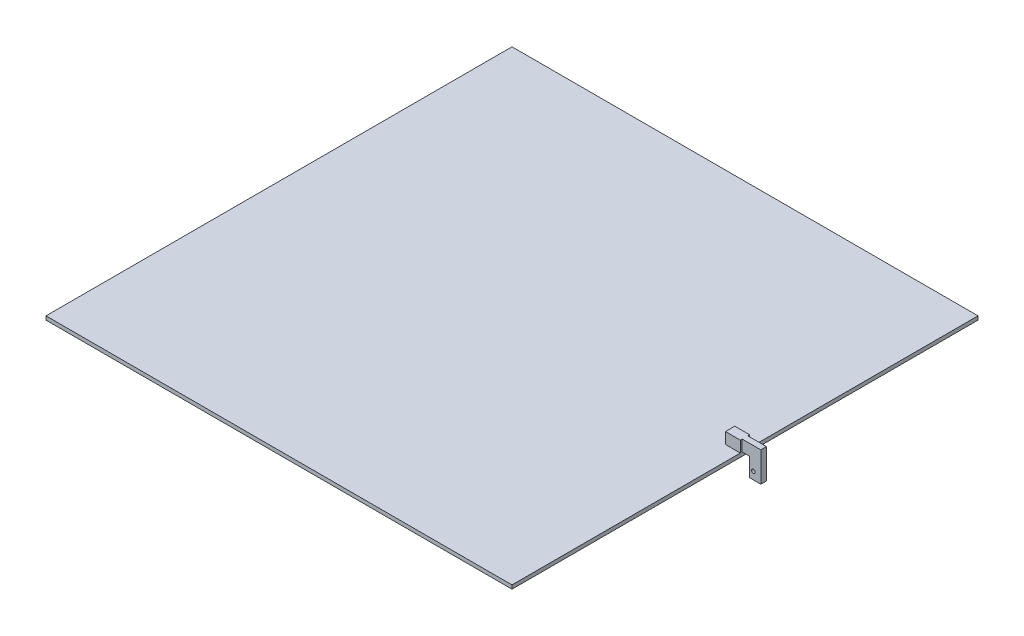
ISO-10303-21;
HEADER;
FILE_DESCRIPTION(('STEP AP214'),'2;1');
FILE_NAME('part.step','',(''),(''),'','','');
FILE_SCHEMA(('AUTOMOTIVE_DESIGN { 1 0 10303 214 1 1 1 1 }'));
ENDSEC;
DATA;
#1=APPLICATION_CONTEXT('core data for automotive mechanical design processes');
#2=APPLICATION_PROTOCOL_DEFINITION('international standard','automotive_design',2000,#1);
#3=PRODUCT_CONTEXT('',#1,'mechanical');
#4=PRODUCT('Part','Part','',(#3));
#5=PRODUCT_RELATED_PRODUCT_CATEGORY('part','',(#4));
#6=PRODUCT_DEFINITION_FORMATION('','',#4);
#7=PRODUCT_DEFINITION_CONTEXT('part definition',#1,'design');
#8=PRODUCT_DEFINITION('design','',#6,#7);
#9=PRODUCT_DEFINITION_SHAPE('','',#8);
#10=(LENGTH_UNIT() NAMED_UNIT(*) SI_UNIT(.MILLI.,.METRE.));
#11=(NAMED_UNIT(*) PLANE_ANGLE_UNIT() SI_UNIT($,.RADIAN.));
#12=(NAMED_UNIT(*) SI_UNIT($,.STERADIAN.) SOLID_ANGLE_UNIT());
#13=UNCERTAINTY_MEASURE_WITH_UNIT(LENGTH_MEASURE(1.E-05),#10,'distance_accuracy_value','');
#14=(GEOMETRIC_REPRESENTATION_CONTEXT(3) GLOBAL_UNCERTAINTY_ASSIGNED_CONTEXT((#13)) GLOBAL_UNIT_ASSIGNED_CONTEXT((#10,
#11,#12)) REPRESENTATION_CONTEXT('',''));
#15=CARTESIAN_POINT('',(0.,0.,0.));
#16=DIRECTION('',(0.,0.,1.));
#17=DIRECTION('',(1.,0.,0.));
#18=AXIS2_PLACEMENT_3D('',#15,#16,#17);
#19=CARTESIAN_POINT('',(135.,2.,2.5));
#20=DIRECTION('',(0.,1.,0.));
#21=DIRECTION('',(0.,0.,1.));
#22=AXIS2_PLACEMENT_3D('',#19,#20,#21);
#23=PLANE('',#22);
#24=DIRECTION('',(0.,0.,-1.));
#25=VECTOR('',#24,1.);
#26=CARTESIAN_POINT('',(129.,2.,2.5));
#27=LINE('',#26,#25);
#28=CARTESIAN_POINT('',(129.,2.,1.5));
#29=VERTEX_POINT('',#28);
#30=CARTESIAN_POINT('',(129.,2.,-1.5));
#31=VERTEX_POINT('',#30);
#32=EDGE_CURVE('E165',#29,#31,#27,.T.);
#33=ORIENTED_EDGE('',*,*,#32,.F.);
#34=DIRECTION('',(1.,0.,0.));
#35=VECTOR('',#34,1.);
#36=CARTESIAN_POINT('',(135.,2.,1.5));
#37=LINE('',#36,#35);
#38=CARTESIAN_POINT('',(125.,2.,1.5));
#39=VERTEX_POINT('',#38);
#40=EDGE_CURVE('E170',#39,#29,#37,.T.);
#41=ORIENTED_EDGE('',*,*,#40,.F.);
#42=DIRECTION('',(0.,0.,-1.));
#43=VECTOR('',#42,1.);
#44=CARTESIAN_POINT('',(125.,2.,2.5));
#45=LINE('',#44,#43);
#46=CARTESIAN_POINT('',(125.,2.,-1.5));
#47=VERTEX_POINT('',#46);
#48=EDGE_CURVE('E167',#39,#47,#45,.T.);
#49=ORIENTED_EDGE('',*,*,#48,.T.);
#50=DIRECTION('',(-1.,0.,0.));
#51=VECTOR('',#50,1.);
#52=CARTESIAN_POINT('',(125.,2.,-1.5));
#53=LINE('',#52,#51);
#54=EDGE_CURVE('E402',#31,#47,#53,.T.);
#55=ORIENTED_EDGE('',*,*,#54,.F.);
#56=EDGE_LOOP('',(#33,#41,#49,#55));
#57=FACE_BOUND('',#56,.T.);
#58=ADVANCED_FACE('F41',(#57),#23,.F.);
#59=CARTESIAN_POINT('',(125.,2.,-125.));
#60=DIRECTION('',(-1.,0.,0.));
#61=DIRECTION('',(0.,0.,1.));
#62=AXIS2_PLACEMENT_3D('',#59,#60,#61);
#63=PLANE('',#62);
#64=ORIENTED_EDGE('',*,*,#48,.F.);
#65=DIRECTION('',(0.,1.,0.));
#66=VECTOR('',#65,1.);
#67=CARTESIAN_POINT('',(125.,-8.001,1.5));
#68=LINE('',#67,#66);
#69=CARTESIAN_POINT('',(125.,8.,1.5));
#70=VERTEX_POINT('',#69);
#71=EDGE_CURVE('E159',#39,#70,#68,.T.);
#72=ORIENTED_EDGE('',*,*,#71,.T.);
#73=DIRECTION('',(0.,0.,1.));
#74=VECTOR('',#73,1.);
#75=CARTESIAN_POINT('',(125.,8.,1.5));
#76=LINE('',#75,#74);
#77=CARTESIAN_POINT('',(125.,8.,2.5));
#78=VERTEX_POINT('',#77);
#79=EDGE_CURVE('E160',#70,#78,#76,.T.);
#80=ORIENTED_EDGE('',*,*,#79,.T.);
#81=DIRECTION('',(0.,1.,0.));
#82=VECTOR('',#81,1.);
#83=CARTESIAN_POINT('',(125.,-8.001,2.5));
#84=LINE('',#83,#82);
#85=CARTESIAN_POINT('',(125.,2.,2.5));
#86=VERTEX_POINT('',#85);
#87=EDGE_CURVE('E247',#86,#78,#84,.T.);
#88=ORIENTED_EDGE('',*,*,#87,.F.);
#89=DIRECTION('',(0.,0.,-1.));
#90=VECTOR('',#89,1.);
#91=CARTESIAN_POINT('',(125.,2.,-125.));
#92=LINE('',#91,#90);
#93=CARTESIAN_POINT('',(125.,2.,125.));
#94=VERTEX_POINT('',#93);
#95=EDGE_CURVE('E202',#94,#86,#92,.T.);
#96=ORIENTED_EDGE('',*,*,#95,.F.);
#97=DIRECTION('',(0.,-1.,0.));
#98=VECTOR('',#97,1.);
#99=CARTESIAN_POINT('',(125.,2.,125.));
#100=LINE('',#99,#98);
#101=CARTESIAN_POINT('',(125.,0.,125.));
#102=VERTEX_POINT('',#101);
#103=EDGE_CURVE('E212',#94,#102,#100,.T.);
#104=ORIENTED_EDGE('',*,*,#103,.T.);
#105=DIRECTION('',(0.,0.,-1.));
#106=VECTOR('',#105,1.);
#107=CARTESIAN_POINT('',(125.,0.,-125.));
#108=LINE('',#107,#106);
#109=CARTESIAN_POINT('',(125.,0.,-125.));
#110=VERTEX_POINT('',#109);
#111=EDGE_CURVE('E201',#102,#110,#108,.T.);
#112=ORIENTED_EDGE('',*,*,#111,.T.);
#113=DIRECTION('',(0.,-1.,0.));
#114=VECTOR('',#113,1.);
#115=CARTESIAN_POINT('',(125.,2.,-125.));
#116=LINE('',#115,#114);
#117=CARTESIAN_POINT('',(125.,2.,-125.));
#118=VERTEX_POINT('',#117);
#119=EDGE_CURVE('E11',#118,#110,#116,.T.);
#120=ORIENTED_EDGE('',*,*,#119,.F.);
#121=CARTESIAN_POINT('',(125.,2.,-2.5));
#122=VERTEX_POINT('',#121);
#123=EDGE_CURVE('E206',#122,#118,#92,.T.);
#124=ORIENTED_EDGE('',*,*,#123,.F.);
#125=DIRECTION('',(0.,1.,0.));
#126=VECTOR('',#125,1.);
#127=CARTESIAN_POINT('',(125.,-8.001,-2.5));
#128=LINE('',#127,#126);
#129=CARTESIAN_POINT('',(125.,8.,-2.5));
#130=VERTEX_POINT('',#129);
#131=EDGE_CURVE('E173',#122,#130,#128,.T.);
#132=ORIENTED_EDGE('',*,*,#131,.T.);
#133=DIRECTION('',(0.,0.,1.));
#134=VECTOR('',#133,1.);
#135=CARTESIAN_POINT('',(125.,8.,-2.5));
#136=LINE('',#135,#134);
#137=CARTESIAN_POINT('',(125.,8.,-1.5));
#138=VERTEX_POINT('',#137);
#139=EDGE_CURVE('E418',#130,#138,#136,.T.);
#140=ORIENTED_EDGE('',*,*,#139,.T.);
#141=DIRECTION('',(0.,1.,0.));
#142=VECTOR('',#141,1.);
#143=CARTESIAN_POINT('',(125.,-8.001,-1.5));
#144=LINE('',#143,#142);
#145=EDGE_CURVE('E265',#47,#138,#144,.T.);
#146=ORIENTED_EDGE('',*,*,#145,.F.);
#147=EDGE_LOOP('',(#64,#72,#80,#88,#96,#104,#112,#120,#124,#132,#140,#146));
#148=FACE_BOUND('',#147,.T.);
#149=ADVANCED_FACE('F43',(#148),#63,.F.);
#150=CARTESIAN_POINT('',(-125.,2.,-125.));
#151=DIRECTION('',(0.,0.,1.));
#152=DIRECTION('',(1.,0.,0.));
#153=AXIS2_PLACEMENT_3D('',#150,#151,#152);
#154=PLANE('',#153);
#155=DIRECTION('',(-1.,0.,0.));
#156=VECTOR('',#155,1.);
#157=CARTESIAN_POINT('',(-125.,0.,-125.));
#158=LINE('',#157,#156);
#159=CARTESIAN_POINT('',(-125.,0.,-125.));
#160=VERTEX_POINT('',#159);
#161=EDGE_CURVE('E215',#110,#160,#158,.T.);
#162=ORIENTED_EDGE('',*,*,#161,.T.);
#163=DIRECTION('',(0.,-1.,0.));
#164=VECTOR('',#163,1.);
#165=CARTESIAN_POINT('',(-125.,2.,-125.));
#166=LINE('',#165,#164);
#167=CARTESIAN_POINT('',(-125.,2.,-125.));
#168=VERTEX_POINT('',#167);
#169=EDGE_CURVE('E49',#168,#160,#166,.T.);
#170=ORIENTED_EDGE('',*,*,#169,.F.);
#171=DIRECTION('',(-1.,0.,0.));
#172=VECTOR('',#171,1.);
#173=CARTESIAN_POINT('',(-125.,2.,-125.));
#174=LINE('',#173,#172);
#175=EDGE_CURVE('E205',#118,#168,#174,.T.);
#176=ORIENTED_EDGE('',*,*,#175,.F.);
#177=ORIENTED_EDGE('',*,*,#119,.T.);
#178=EDGE_LOOP('',(#162,#170,#176,#177));
#179=FACE_BOUND('',#178,.T.);
#180=ADVANCED_FACE('F267',(#179),#154,.F.);
#181=CARTESIAN_POINT('',(-125.,2.,-125.));
#182=DIRECTION('',(1.,0.,0.));
#183=DIRECTION('',(0.,0.,-1.));
#184=AXIS2_PLACEMENT_3D('',#181,#182,#183);
#185=PLANE('',#184);
#186=DIRECTION('',(0.,0.,1.));
#187=VECTOR('',#186,1.);
#188=CARTESIAN_POINT('',(-125.,0.,-125.));
#189=LINE('',#188,#187);
#190=CARTESIAN_POINT('',(-125.,0.,125.));
#191=VERTEX_POINT('',#190);
#192=EDGE_CURVE('E217',#160,#191,#189,.T.);
#193=ORIENTED_EDGE('',*,*,#192,.T.);
#194=DIRECTION('',(0.,-1.,0.));
#195=VECTOR('',#194,1.);
#196=CARTESIAN_POINT('',(-125.,2.,125.));
#197=LINE('',#196,#195);
#198=CARTESIAN_POINT('',(-125.,2.,125.));
#199=VERTEX_POINT('',#198);
#200=EDGE_CURVE('E223',#199,#191,#197,.T.);
#201=ORIENTED_EDGE('',*,*,#200,.F.);
#202=DIRECTION('',(0.,0.,1.));
#203=VECTOR('',#202,1.);
#204=CARTESIAN_POINT('',(-125.,2.,-125.));
#205=LINE('',#204,#203);
#206=EDGE_CURVE('E208',#168,#199,#205,.T.);
#207=ORIENTED_EDGE('',*,*,#206,.F.);
#208=ORIENTED_EDGE('',*,*,#169,.T.);
#209=EDGE_LOOP('',(#193,#201,#207,#208));
#210=FACE_BOUND('',#209,.T.);
#211=ADVANCED_FACE('F230',(#210),#185,.F.);
#212=CARTESIAN_POINT('',(-125.,2.,125.));
#213=DIRECTION('',(0.,0.,-1.));
#214=DIRECTION('',(-1.,0.,0.));
#215=AXIS2_PLACEMENT_3D('',#212,#213,#214);
#216=PLANE('',#215);
#217=DIRECTION('',(1.,0.,0.));
#218=VECTOR('',#217,1.);
#219=CARTESIAN_POINT('',(-125.,0.,125.));
#220=LINE('',#219,#218);
#221=EDGE_CURVE('E219',#191,#102,#220,.T.);
#222=ORIENTED_EDGE('',*,*,#221,.T.);
#223=ORIENTED_EDGE('',*,*,#103,.F.);
#224=DIRECTION('',(1.,0.,0.));
#225=VECTOR('',#224,1.);
#226=CARTESIAN_POINT('',(-125.,2.,125.));
#227=LINE('',#226,#225);
#228=EDGE_CURVE('E210',#199,#94,#227,.T.);
#229=ORIENTED_EDGE('',*,*,#228,.F.);
#230=ORIENTED_EDGE('',*,*,#200,.T.);
#231=EDGE_LOOP('',(#222,#223,#229,#230));
#232=FACE_BOUND('',#231,.T.);
#233=ADVANCED_FACE('F240',(#232),#216,.F.);
#234=CARTESIAN_POINT('',(0.,2.,0.));
#235=DIRECTION('',(0.,1.,0.));
#236=DIRECTION('',(0.,0.,1.));
#237=AXIS2_PLACEMENT_3D('',#234,#235,#236);
#238=PLANE('',#237);
#239=DIRECTION('',(1.,0.,0.));
#240=VECTOR('',#239,1.);
#241=CARTESIAN_POINT('',(117.,2.,2.5));
#242=LINE('',#241,#240);
#243=CARTESIAN_POINT('',(117.,2.,2.5));
#244=VERTEX_POINT('',#243);
#245=EDGE_CURVE('E183',#244,#86,#242,.T.);
#246=ORIENTED_EDGE('',*,*,#245,.F.);
#247=DIRECTION('',(0.,0.,1.));
#248=VECTOR('',#247,1.);
#249=CARTESIAN_POINT('',(117.,2.,-2.5));
#250=LINE('',#249,#248);
#251=CARTESIAN_POINT('',(117.,2.,-2.5));
#252=VERTEX_POINT('',#251);
#253=EDGE_CURVE('E191',#252,#244,#250,.T.);
#254=ORIENTED_EDGE('',*,*,#253,.F.);
#255=DIRECTION('',(-1.,0.,0.));
#256=VECTOR('',#255,1.);
#257=CARTESIAN_POINT('',(125.,2.,-2.5));
#258=LINE('',#257,#256);
#259=EDGE_CURVE('E177',#122,#252,#258,.T.);
#260=ORIENTED_EDGE('',*,*,#259,.F.);
#261=ORIENTED_EDGE('',*,*,#123,.T.);
#262=ORIENTED_EDGE('',*,*,#175,.T.);
#263=ORIENTED_EDGE('',*,*,#206,.T.);
#264=ORIENTED_EDGE('',*,*,#228,.T.);
#265=ORIENTED_EDGE('',*,*,#95,.T.);
#266=EDGE_LOOP('',(#246,#254,#260,#261,#262,#263,#264,#265));
#267=FACE_BOUND('',#266,.T.);
#268=ADVANCED_FACE('F249',(#267),#238,.T.);
#269=CARTESIAN_POINT('',(0.,0.,0.));
#270=DIRECTION('',(0.,1.,0.));
#271=DIRECTION('',(0.,0.,1.));
#272=AXIS2_PLACEMENT_3D('',#269,#270,#271);
#273=PLANE('',#272);
#274=ORIENTED_EDGE('',*,*,#111,.F.);
#275=ORIENTED_EDGE('',*,*,#221,.F.);
#276=ORIENTED_EDGE('',*,*,#192,.F.);
#277=ORIENTED_EDGE('',*,*,#161,.F.);
#278=EDGE_LOOP('',(#274,#275,#276,#277));
#279=FACE_BOUND('',#278,.T.);
#280=ADVANCED_FACE('F237',(#279),#273,.F.);
#281=CARTESIAN_POINT('',(125.,8.,-2.5));
#282=DIRECTION('',(0.,0.,1.));
#283=DIRECTION('',(1.,0.,0.));
#284=AXIS2_PLACEMENT_3D('',#281,#282,#283);
#285=PLANE('',#284);
#286=DIRECTION('',(-1.,0.,0.));
#287=VECTOR('',#286,1.);
#288=CARTESIAN_POINT('',(125.,8.,-2.5));
#289=LINE('',#288,#287);
#290=CARTESIAN_POINT('',(117.,8.,-2.5));
#291=VERTEX_POINT('',#290);
#292=EDGE_CURVE('E180',#130,#291,#289,.T.);
#293=ORIENTED_EDGE('',*,*,#292,.F.);
#294=ORIENTED_EDGE('',*,*,#131,.F.);
#295=ORIENTED_EDGE('',*,*,#259,.T.);
#296=DIRECTION('',(0.,-1.,0.));
#297=VECTOR('',#296,1.);
#298=CARTESIAN_POINT('',(117.,8.,-2.5));
#299=LINE('',#298,#297);
#300=EDGE_CURVE('E198',#291,#252,#299,.T.);
#301=ORIENTED_EDGE('',*,*,#300,.F.);
#302=EDGE_LOOP('',(#293,#294,#295,#301));
#303=FACE_BOUND('',#302,.T.);
#304=ADVANCED_FACE('F261',(#303),#285,.F.);
#305=CARTESIAN_POINT('',(117.,8.,-2.5));
#306=DIRECTION('',(1.,0.,0.));
#307=DIRECTION('',(0.,0.,-1.));
#308=AXIS2_PLACEMENT_3D('',#305,#306,#307);
#309=PLANE('',#308);
#310=ORIENTED_EDGE('',*,*,#253,.T.);
#311=DIRECTION('',(0.,-1.,0.));
#312=VECTOR('',#311,1.);
#313=CARTESIAN_POINT('',(117.,8.,2.5));
#314=LINE('',#313,#312);
#315=CARTESIAN_POINT('',(117.,8.,2.5));
#316=VERTEX_POINT('',#315);
#317=EDGE_CURVE('E188',#316,#244,#314,.T.);
#318=ORIENTED_EDGE('',*,*,#317,.F.);
#319=DIRECTION('',(0.,0.,1.));
#320=VECTOR('',#319,1.);
#321=CARTESIAN_POINT('',(117.,8.,-2.5));
#322=LINE('',#321,#320);
#323=EDGE_CURVE('E182',#291,#316,#322,.T.);
#324=ORIENTED_EDGE('',*,*,#323,.F.);
#325=ORIENTED_EDGE('',*,*,#300,.T.);
#326=EDGE_LOOP('',(#310,#318,#324,#325));
#327=FACE_BOUND('',#326,.T.);
#328=ADVANCED_FACE('F256',(#327),#309,.F.);
#329=CARTESIAN_POINT('',(117.,8.,2.5));
#330=DIRECTION('',(0.,0.,-1.));
#331=DIRECTION('',(-1.,0.,0.));
#332=AXIS2_PLACEMENT_3D('',#329,#330,#331);
#333=PLANE('',#332);
#334=ORIENTED_EDGE('',*,*,#245,.T.);
#335=ORIENTED_EDGE('',*,*,#87,.T.);
#336=DIRECTION('',(1.,0.,0.));
#337=VECTOR('',#336,1.);
#338=CARTESIAN_POINT('',(117.,8.,2.5));
#339=LINE('',#338,#337);
#340=EDGE_CURVE('E185',#316,#78,#339,.T.);
#341=ORIENTED_EDGE('',*,*,#340,.F.);
#342=ORIENTED_EDGE('',*,*,#317,.T.);
#343=EDGE_LOOP('',(#334,#335,#341,#342));
#344=FACE_BOUND('',#343,.T.);
#345=ADVANCED_FACE('F251',(#344),#333,.F.);
#346=CARTESIAN_POINT('',(0.,8.,0.));
#347=DIRECTION('',(0.,1.,0.));
#348=DIRECTION('',(0.,0.,1.));
#349=AXIS2_PLACEMENT_3D('',#346,#347,#348);
#350=PLANE('',#349);
#351=ORIENTED_EDGE('',*,*,#79,.F.);
#352=DIRECTION('',(-1.,0.,0.));
#353=VECTOR('',#352,1.);
#354=CARTESIAN_POINT('',(135.,8.,1.5));
#355=LINE('',#354,#353);
#356=CARTESIAN_POINT('',(135.,8.,1.5));
#357=VERTEX_POINT('',#356);
#358=EDGE_CURVE('E407',#357,#70,#355,.T.);
#359=ORIENTED_EDGE('',*,*,#358,.F.);
#360=DIRECTION('',(0.,0.,1.));
#361=VECTOR('',#360,1.);
#362=CARTESIAN_POINT('',(135.,8.,2.5));
#363=LINE('',#362,#361);
#364=CARTESIAN_POINT('',(135.,8.,-1.5));
#365=VERTEX_POINT('',#364);
#366=EDGE_CURVE('E158',#365,#357,#363,.T.);
#367=ORIENTED_EDGE('',*,*,#366,.F.);
#368=DIRECTION('',(1.,0.,0.));
#369=VECTOR('',#368,1.);
#370=CARTESIAN_POINT('',(125.,8.,-1.5));
#371=LINE('',#370,#369);
#372=EDGE_CURVE('E266',#138,#365,#371,.T.);
#373=ORIENTED_EDGE('',*,*,#372,.F.);
#374=ORIENTED_EDGE('',*,*,#139,.F.);
#375=ORIENTED_EDGE('',*,*,#292,.T.);
#376=ORIENTED_EDGE('',*,*,#323,.T.);
#377=ORIENTED_EDGE('',*,*,#340,.T.);
#378=EDGE_LOOP('',(#351,#359,#367,#373,#374,#375,#376,#377));
#379=FACE_BOUND('',#378,.T.);
#380=ADVANCED_FACE('F284',(#379),#350,.T.);
#381=CARTESIAN_POINT('',(135.,0.,0.));
#382=DIRECTION('',(1.,0.,0.));
#383=DIRECTION('',(0.,0.,-1.));
#384=AXIS2_PLACEMENT_3D('',#381,#382,#383);
#385=PLANE('',#384);
#386=DIRECTION('',(0.,1.,0.));
#387=VECTOR('',#386,1.);
#388=CARTESIAN_POINT('',(135.,-8.001,1.5));
#389=LINE('',#388,#387);
#390=CARTESIAN_POINT('',(135.,-8.,1.5));
#391=VERTEX_POINT('',#390);
#392=EDGE_CURVE('E144',#391,#357,#389,.T.);
#393=ORIENTED_EDGE('',*,*,#392,.F.);
#394=DIRECTION('',(0.,0.,1.));
#395=VECTOR('',#394,1.);
#396=CARTESIAN_POINT('',(135.,-8.,2.5));
#397=LINE('',#396,#395);
#398=CARTESIAN_POINT('',(135.,-8.,-1.5));
#399=VERTEX_POINT('',#398);
#400=EDGE_CURVE('E156',#399,#391,#397,.T.);
#401=ORIENTED_EDGE('',*,*,#400,.F.);
#402=DIRECTION('',(0.,1.,0.));
#403=VECTOR('',#402,1.);
#404=CARTESIAN_POINT('',(135.,-8.001,-1.5));
#405=LINE('',#404,#403);
#406=EDGE_CURVE('E64',#399,#365,#405,.T.);
#407=ORIENTED_EDGE('',*,*,#406,.T.);
#408=ORIENTED_EDGE('',*,*,#366,.T.);
#409=EDGE_LOOP('',(#393,#401,#407,#408));
#410=FACE_BOUND('',#409,.T.);
#411=ADVANCED_FACE('F155',(#410),#385,.T.);
#412=CARTESIAN_POINT('',(129.,-8.,2.5));
#413=DIRECTION('',(1.,0.,0.));
#414=DIRECTION('',(0.,0.,-1.));
#415=AXIS2_PLACEMENT_3D('',#412,#413,#414);
#416=PLANE('',#415);
#417=DIRECTION('',(0.,0.,-1.));
#418=VECTOR('',#417,1.);
#419=CARTESIAN_POINT('',(129.,-8.,2.5));
#420=LINE('',#419,#418);
#421=CARTESIAN_POINT('',(129.,-8.,1.5));
#422=VERTEX_POINT('',#421);
#423=CARTESIAN_POINT('',(129.,-8.,-1.5));
#424=VERTEX_POINT('',#423);
#425=EDGE_CURVE('E164',#422,#424,#420,.T.);
#426=ORIENTED_EDGE('',*,*,#425,.F.);
#427=DIRECTION('',(0.,-1.,0.));
#428=VECTOR('',#427,1.);
#429=CARTESIAN_POINT('',(129.,-8.001,1.5));
#430=LINE('',#429,#428);
#431=EDGE_CURVE('E56',#29,#422,#430,.T.);
#432=ORIENTED_EDGE('',*,*,#431,.F.);
#433=ORIENTED_EDGE('',*,*,#32,.T.);
#434=DIRECTION('',(0.,1.,0.));
#435=VECTOR('',#434,1.);
#436=CARTESIAN_POINT('',(129.,-8.001,-1.5));
#437=LINE('',#436,#435);
#438=EDGE_CURVE('E415',#424,#31,#437,.T.);
#439=ORIENTED_EDGE('',*,*,#438,.F.);
#440=EDGE_LOOP('',(#426,#432,#433,#439));
#441=FACE_BOUND('',#440,.T.);
#442=ADVANCED_FACE('F358',(#441),#416,.F.);
#443=CARTESIAN_POINT('',(0.,-8.,0.));
#444=DIRECTION('',(0.,1.,0.));
#445=DIRECTION('',(0.,0.,1.));
#446=AXIS2_PLACEMENT_3D('',#443,#444,#445);
#447=PLANE('',#446);
#448=ORIENTED_EDGE('',*,*,#400,.T.);
#449=DIRECTION('',(1.,0.,0.));
#450=VECTOR('',#449,1.);
#451=CARTESIAN_POINT('',(135.,-8.,1.5));
#452=LINE('',#451,#450);
#453=EDGE_CURVE('E139',#422,#391,#452,.T.);
#454=ORIENTED_EDGE('',*,*,#453,.F.);
#455=ORIENTED_EDGE('',*,*,#425,.T.);
#456=DIRECTION('',(-1.,0.,0.));
#457=VECTOR('',#456,1.);
#458=CARTESIAN_POINT('',(125.,-8.,-1.5));
#459=LINE('',#458,#457);
#460=EDGE_CURVE('E163',#399,#424,#459,.T.);
#461=ORIENTED_EDGE('',*,*,#460,.F.);
#462=EDGE_LOOP('',(#448,#454,#455,#461));
#463=FACE_BOUND('',#462,.T.);
#464=ADVANCED_FACE('F162',(#463),#447,.F.);
#465=CARTESIAN_POINT('',(125.,-8.001,-1.5));
#466=DIRECTION('',(0.,0.,1.));
#467=DIRECTION('',(1.,0.,0.));
#468=AXIS2_PLACEMENT_3D('',#465,#466,#467);
#469=PLANE('',#468);
#470=ORIENTED_EDGE('',*,*,#54,.T.);
#471=ORIENTED_EDGE('',*,*,#145,.T.);
#472=ORIENTED_EDGE('',*,*,#372,.T.);
#473=ORIENTED_EDGE('',*,*,#406,.F.);
#474=ORIENTED_EDGE('',*,*,#460,.T.);
#475=ORIENTED_EDGE('',*,*,#438,.T.);
#476=EDGE_LOOP('',(#470,#471,#472,#473,#474,#475));
#477=FACE_BOUND('',#476,.T.);
#478=CARTESIAN_POINT('',(131.,-4.00000000000047,-1.5));
#479=DIRECTION('',(0.,0.,1.));
#480=DIRECTION('',(1.,0.,0.));
#481=AXIS2_PLACEMENT_3D('',#478,#479,#480);
#482=CIRCLE('',#481,0.983022382946199);
#483=CARTESIAN_POINT('',(131.983022382946,-4.00000000000047,-1.5));
#484=VERTEX_POINT('',#483);
#485=EDGE_CURVE('E405',#484,#484,#482,.T.);
#486=ORIENTED_EDGE('',*,*,#485,.T.);
#487=EDGE_LOOP('',(#486));
#488=FACE_BOUND('',#487,.T.);
#489=ADVANCED_FACE('F371',(#477,#488),#469,.F.);
#490=CARTESIAN_POINT('',(135.,-8.001,1.5));
#491=DIRECTION('',(0.,0.,-1.));
#492=DIRECTION('',(-1.,0.,0.));
#493=AXIS2_PLACEMENT_3D('',#490,#491,#492);
#494=PLANE('',#493);
#495=ORIENTED_EDGE('',*,*,#40,.T.);
#496=ORIENTED_EDGE('',*,*,#431,.T.);
#497=ORIENTED_EDGE('',*,*,#453,.T.);
#498=ORIENTED_EDGE('',*,*,#392,.T.);
#499=ORIENTED_EDGE('',*,*,#358,.T.);
#500=ORIENTED_EDGE('',*,*,#71,.F.);
#501=EDGE_LOOP('',(#495,#496,#497,#498,#499,#500));
#502=FACE_BOUND('',#501,.T.);
#503=CARTESIAN_POINT('',(131.,-4.00000000000047,1.5));
#504=DIRECTION('',(0.,0.,-1.));
#505=DIRECTION('',(-1.,0.,0.));
#506=AXIS2_PLACEMENT_3D('',#503,#504,#505);
#507=CIRCLE('',#506,0.983022382946199);
#508=CARTESIAN_POINT('',(130.016977617054,-4.00000000000047,1.5));
#509=VERTEX_POINT('',#508);
#510=EDGE_CURVE('E150',#509,#509,#507,.T.);
#511=ORIENTED_EDGE('',*,*,#510,.T.);
#512=EDGE_LOOP('',(#511));
#513=FACE_BOUND('',#512,.T.);
#514=ADVANCED_FACE('F141',(#502,#513),#494,.F.);
#515=CARTESIAN_POINT('',(131.,-4.00000000000047,125.001));
#516=DIRECTION('',(0.,0.,-1.));
#517=DIRECTION('',(-1.,0.,0.));
#518=AXIS2_PLACEMENT_3D('',#515,#516,#517);
#519=CYLINDRICAL_SURFACE('',#518,0.983022382946199);
#520=ORIENTED_EDGE('',*,*,#510,.F.);
#521=EDGE_LOOP('',(#520));
#522=FACE_BOUND('',#521,.T.);
#523=ORIENTED_EDGE('',*,*,#485,.F.);
#524=EDGE_LOOP('',(#523));
#525=FACE_BOUND('',#524,.T.);
#526=ADVANCED_FACE('F375',(#522,#525),#519,.F.);
#527=CLOSED_SHELL('',(#58,#149,#180,#211,#233,#268,#280,#304,#328,#345,#380,#411,#442,#464,#489,
#514,#526));
#528=MANIFOLD_SOLID_BREP('B2',#527);
#529=ADVANCED_BREP_SHAPE_REPRESENTATION('',(#18,#528),#14);
#530=SHAPE_DEFINITION_REPRESENTATION(#9,#529);
ENDSEC;
END-ISO-10303-21;
